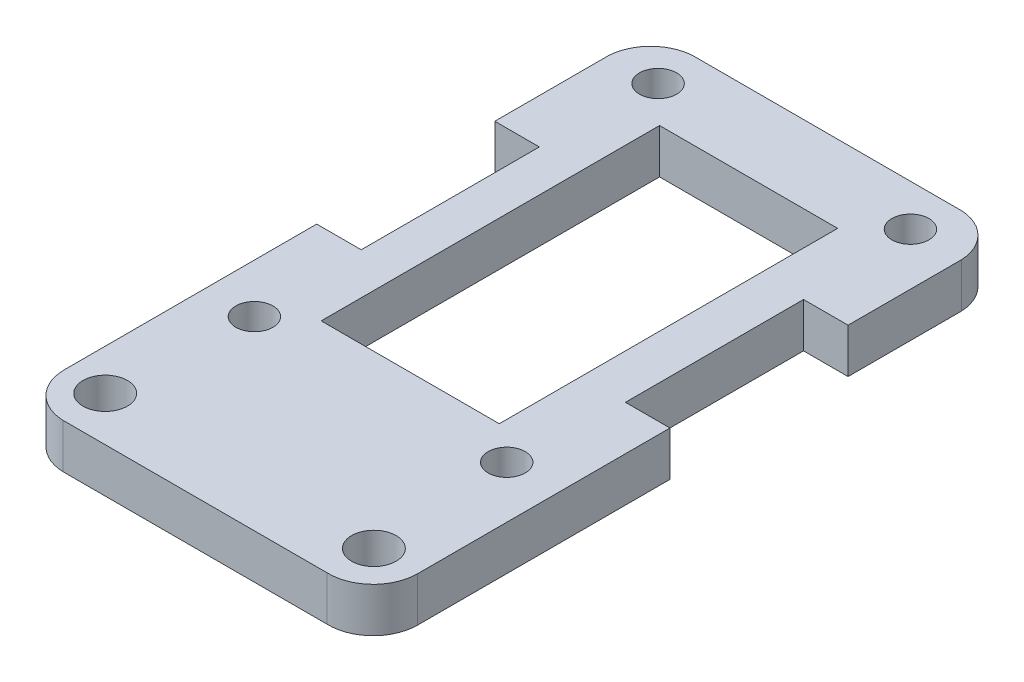
ISO-10303-21;
HEADER;
FILE_DESCRIPTION(('STEP AP214'),'2;1');
FILE_NAME('part.step','',(''),(''),'','','');
FILE_SCHEMA(('AUTOMOTIVE_DESIGN { 1 0 10303 214 1 1 1 1 }'));
ENDSEC;
DATA;
#1=APPLICATION_CONTEXT('core data for automotive mechanical design processes');
#2=APPLICATION_PROTOCOL_DEFINITION('international standard','automotive_design',2000,#1);
#3=PRODUCT_CONTEXT('',#1,'mechanical');
#4=PRODUCT('Part','Part','',(#3));
#5=PRODUCT_RELATED_PRODUCT_CATEGORY('part','',(#4));
#6=PRODUCT_DEFINITION_FORMATION('','',#4);
#7=PRODUCT_DEFINITION_CONTEXT('part definition',#1,'design');
#8=PRODUCT_DEFINITION('design','',#6,#7);
#9=PRODUCT_DEFINITION_SHAPE('','',#8);
#10=(LENGTH_UNIT() NAMED_UNIT(*) SI_UNIT(.MILLI.,.METRE.));
#11=(NAMED_UNIT(*) PLANE_ANGLE_UNIT() SI_UNIT($,.RADIAN.));
#12=(NAMED_UNIT(*) SI_UNIT($,.STERADIAN.) SOLID_ANGLE_UNIT());
#13=UNCERTAINTY_MEASURE_WITH_UNIT(LENGTH_MEASURE(1.E-05),#10,'distance_accuracy_value','');
#14=(GEOMETRIC_REPRESENTATION_CONTEXT(3) GLOBAL_UNCERTAINTY_ASSIGNED_CONTEXT((#13)) GLOBAL_UNIT_ASSIGNED_CONTEXT((#10,
#11,#12)) REPRESENTATION_CONTEXT('',''));
#15=CARTESIAN_POINT('',(0.,0.,0.));
#16=DIRECTION('',(0.,0.,1.));
#17=DIRECTION('',(1.,0.,0.));
#18=AXIS2_PLACEMENT_3D('',#15,#16,#17);
#19=CARTESIAN_POINT('',(-2.44967043371681E-10,3.,-87.9859491726357));
#20=DIRECTION('',(-2.78416094473261E-12,0.,-1.));
#21=DIRECTION('',(-1.,0.,2.78416094473261E-12));
#22=AXIS2_PLACEMENT_3D('',#19,#20,#21);
#23=PLANE('',#22);
#24=DIRECTION('',(1.,0.,-2.78416094473261E-12));
#25=VECTOR('',#24,1.);
#26=CARTESIAN_POINT('',(-2.44967043371681E-10,0.,-87.9859491726357));
#27=LINE('',#26,#25);
#28=CARTESIAN_POINT('',(203.897756421798,0.,-87.9859491732078));
#29=VERTEX_POINT('',#28);
#30=CARTESIAN_POINT('',(221.698885039651,0.,-87.9859491732529));
#31=VERTEX_POINT('',#30);
#32=EDGE_CURVE('E239',#29,#31,#27,.T.);
#33=ORIENTED_EDGE('',*,*,#32,.T.);
#34=DIRECTION('',(0.,-1.,0.));
#35=VECTOR('',#34,1.);
#36=CARTESIAN_POINT('',(221.698885039651,3.,-87.9859491732529));
#37=LINE('',#36,#35);
#38=CARTESIAN_POINT('',(221.698885039651,3.,-87.9859491732529));
#39=VERTEX_POINT('',#38);
#40=EDGE_CURVE('E11',#39,#31,#37,.T.);
#41=ORIENTED_EDGE('',*,*,#40,.F.);
#42=DIRECTION('',(1.,0.,-2.78416094473261E-12));
#43=VECTOR('',#42,1.);
#44=CARTESIAN_POINT('',(-2.44967043371681E-10,3.,-87.9859491726357));
#45=LINE('',#44,#43);
#46=CARTESIAN_POINT('',(203.897756421798,3.,-87.9859491732078));
#47=VERTEX_POINT('',#46);
#48=EDGE_CURVE('E354',#47,#39,#45,.T.);
#49=ORIENTED_EDGE('',*,*,#48,.F.);
#50=DIRECTION('',(0.,-1.,0.));
#51=VECTOR('',#50,1.);
#52=CARTESIAN_POINT('',(203.897756421798,3.,-87.9859491732078));
#53=LINE('',#52,#51);
#54=EDGE_CURVE('E272',#47,#29,#53,.T.);
#55=ORIENTED_EDGE('',*,*,#54,.T.);
#56=EDGE_LOOP('',(#33,#41,#49,#55));
#57=FACE_BOUND('',#56,.T.);
#58=ADVANCED_FACE('F37',(#57),#23,.F.);
#59=CARTESIAN_POINT('',(221.798921253926,3.,-90.9847615240783));
#60=DIRECTION('',(0.,-1.,0.));
#61=DIRECTION('',(0.,0.,-1.));
#62=AXIS2_PLACEMENT_3D('',#59,#60,#61);
#63=CYLINDRICAL_SURFACE('',#62,3.00048042147074);
#64=CARTESIAN_POINT('',(221.798921253926,0.,-90.9847615240783));
#65=DIRECTION('',(0.,1.,0.));
#66=DIRECTION('',(0.,0.,1.));
#67=AXIS2_PLACEMENT_3D('',#64,#65,#66);
#68=CIRCLE('',#67,3.00048042147074);
#69=CARTESIAN_POINT('',(224.79940166353,0.,-90.9850283744484));
#70=VERTEX_POINT('',#69);
#71=EDGE_CURVE('E242',#31,#70,#68,.T.);
#72=ORIENTED_EDGE('',*,*,#71,.T.);
#73=DIRECTION('',(0.,-1.,0.));
#74=VECTOR('',#73,1.);
#75=CARTESIAN_POINT('',(224.79940166353,3.,-90.9850283744484));
#76=LINE('',#75,#74);
#77=CARTESIAN_POINT('',(224.79940166353,3.,-90.9850283744484));
#78=VERTEX_POINT('',#77);
#79=EDGE_CURVE('E47',#78,#70,#76,.T.);
#80=ORIENTED_EDGE('',*,*,#79,.F.);
#81=CARTESIAN_POINT('',(221.798921253926,3.,-90.9847615240783));
#82=DIRECTION('',(0.,1.,0.));
#83=DIRECTION('',(0.,0.,1.));
#84=AXIS2_PLACEMENT_3D('',#81,#82,#83);
#85=CIRCLE('',#84,3.00048042147074);
#86=EDGE_CURVE('E356',#39,#78,#85,.T.);
#87=ORIENTED_EDGE('',*,*,#86,.F.);
#88=ORIENTED_EDGE('',*,*,#40,.T.);
#89=EDGE_LOOP('',(#72,#80,#87,#88));
#90=FACE_BOUND('',#89,.T.);
#91=ADVANCED_FACE('F407',(#90),#63,.T.);
#92=CARTESIAN_POINT('',(224.79940166353,3.,0.));
#93=DIRECTION('',(-1.,0.,0.));
#94=DIRECTION('',(0.,0.,1.));
#95=AXIS2_PLACEMENT_3D('',#92,#93,#94);
#96=PLANE('',#95);
#97=DIRECTION('',(0.,0.,-1.));
#98=VECTOR('',#97,1.);
#99=CARTESIAN_POINT('',(224.79940166353,0.,0.));
#100=LINE('',#99,#98);
#101=CARTESIAN_POINT('',(224.79940166353,0.,-107.985882496448));
#102=VERTEX_POINT('',#101);
#103=EDGE_CURVE('E244',#70,#102,#100,.T.);
#104=ORIENTED_EDGE('',*,*,#103,.T.);
#105=DIRECTION('',(0.,-1.,0.));
#106=VECTOR('',#105,1.);
#107=CARTESIAN_POINT('',(224.79940166353,3.,-107.985882496448));
#108=LINE('',#107,#106);
#109=CARTESIAN_POINT('',(224.79940166353,3.,-107.985882496448));
#110=VERTEX_POINT('',#109);
#111=EDGE_CURVE('E301',#110,#102,#108,.T.);
#112=ORIENTED_EDGE('',*,*,#111,.F.);
#113=DIRECTION('',(0.,0.,-1.));
#114=VECTOR('',#113,1.);
#115=CARTESIAN_POINT('',(224.79940166353,3.,0.));
#116=LINE('',#115,#114);
#117=EDGE_CURVE('E358',#78,#110,#116,.T.);
#118=ORIENTED_EDGE('',*,*,#117,.F.);
#119=ORIENTED_EDGE('',*,*,#79,.T.);
#120=EDGE_LOOP('',(#104,#112,#118,#119));
#121=FACE_BOUND('',#120,.T.);
#122=ADVANCED_FACE('F412',(#121),#96,.F.);
#123=CARTESIAN_POINT('',(0.,3.,-107.985882496448));
#124=DIRECTION('',(0.,0.,1.));
#125=DIRECTION('',(1.,0.,0.));
#126=AXIS2_PLACEMENT_3D('',#123,#124,#125);
#127=PLANE('',#126);
#128=DIRECTION('',(-1.,0.,0.));
#129=VECTOR('',#128,1.);
#130=CARTESIAN_POINT('',(0.,0.,-107.985882496448));
#131=LINE('',#130,#129);
#132=CARTESIAN_POINT('',(221.79940166353,0.,-107.985882496448));
#133=VERTEX_POINT('',#132);
#134=EDGE_CURVE('E246',#102,#133,#131,.T.);
#135=ORIENTED_EDGE('',*,*,#134,.T.);
#136=DIRECTION('',(0.,-1.,0.));
#137=VECTOR('',#136,1.);
#138=CARTESIAN_POINT('',(221.79940166353,3.,-107.985882496448));
#139=LINE('',#138,#137);
#140=CARTESIAN_POINT('',(221.79940166353,3.,-107.985882496448));
#141=VERTEX_POINT('',#140);
#142=EDGE_CURVE('E298',#141,#133,#139,.T.);
#143=ORIENTED_EDGE('',*,*,#142,.F.);
#144=DIRECTION('',(-1.,0.,0.));
#145=VECTOR('',#144,1.);
#146=CARTESIAN_POINT('',(0.,3.,-107.985882496448));
#147=LINE('',#146,#145);
#148=EDGE_CURVE('E360',#110,#141,#147,.T.);
#149=ORIENTED_EDGE('',*,*,#148,.F.);
#150=ORIENTED_EDGE('',*,*,#111,.T.);
#151=EDGE_LOOP('',(#135,#143,#149,#150));
#152=FACE_BOUND('',#151,.T.);
#153=ADVANCED_FACE('F484',(#152),#127,.F.);
#154=CARTESIAN_POINT('',(221.79940166353,3.,0.));
#155=DIRECTION('',(-1.,0.,0.));
#156=DIRECTION('',(0.,0.,1.));
#157=AXIS2_PLACEMENT_3D('',#154,#155,#156);
#158=PLANE('',#157);
#159=DIRECTION('',(0.,0.,-1.));
#160=VECTOR('',#159,1.);
#161=CARTESIAN_POINT('',(221.79940166353,0.,0.));
#162=LINE('',#161,#160);
#163=CARTESIAN_POINT('',(221.79940166353,0.,-119.985882496448));
#164=VERTEX_POINT('',#163);
#165=EDGE_CURVE('E248',#133,#164,#162,.T.);
#166=ORIENTED_EDGE('',*,*,#165,.T.);
#167=DIRECTION('',(0.,-1.,0.));
#168=VECTOR('',#167,1.);
#169=CARTESIAN_POINT('',(221.79940166353,3.,-119.985882496448));
#170=LINE('',#169,#168);
#171=CARTESIAN_POINT('',(221.79940166353,3.,-119.985882496448));
#172=VERTEX_POINT('',#171);
#173=EDGE_CURVE('E295',#172,#164,#170,.T.);
#174=ORIENTED_EDGE('',*,*,#173,.F.);
#175=DIRECTION('',(0.,0.,-1.));
#176=VECTOR('',#175,1.);
#177=CARTESIAN_POINT('',(221.79940166353,3.,0.));
#178=LINE('',#177,#176);
#179=EDGE_CURVE('E362',#141,#172,#178,.T.);
#180=ORIENTED_EDGE('',*,*,#179,.F.);
#181=ORIENTED_EDGE('',*,*,#142,.T.);
#182=EDGE_LOOP('',(#166,#174,#180,#181));
#183=FACE_BOUND('',#182,.T.);
#184=ADVANCED_FACE('F480',(#183),#158,.F.);
#185=CARTESIAN_POINT('',(0.,3.,-119.985882496448));
#186=DIRECTION('',(0.,0.,-1.));
#187=DIRECTION('',(-1.,0.,0.));
#188=AXIS2_PLACEMENT_3D('',#185,#186,#187);
#189=PLANE('',#188);
#190=DIRECTION('',(1.,0.,0.));
#191=VECTOR('',#190,1.);
#192=CARTESIAN_POINT('',(0.,0.,-119.985882496448));
#193=LINE('',#192,#191);
#194=CARTESIAN_POINT('',(224.79940166353,0.,-119.985882496448));
#195=VERTEX_POINT('',#194);
#196=EDGE_CURVE('E250',#164,#195,#193,.T.);
#197=ORIENTED_EDGE('',*,*,#196,.T.);
#198=DIRECTION('',(0.,-1.,0.));
#199=VECTOR('',#198,1.);
#200=CARTESIAN_POINT('',(224.79940166353,3.,-119.985882496448));
#201=LINE('',#200,#199);
#202=CARTESIAN_POINT('',(224.79940166353,3.,-119.985882496448));
#203=VERTEX_POINT('',#202);
#204=EDGE_CURVE('E292',#203,#195,#201,.T.);
#205=ORIENTED_EDGE('',*,*,#204,.F.);
#206=DIRECTION('',(1.,0.,0.));
#207=VECTOR('',#206,1.);
#208=CARTESIAN_POINT('',(0.,3.,-119.985882496448));
#209=LINE('',#208,#207);
#210=EDGE_CURVE('E364',#172,#203,#209,.T.);
#211=ORIENTED_EDGE('',*,*,#210,.F.);
#212=ORIENTED_EDGE('',*,*,#173,.T.);
#213=EDGE_LOOP('',(#197,#205,#211,#212));
#214=FACE_BOUND('',#213,.T.);
#215=ADVANCED_FACE('F476',(#214),#189,.F.);
#216=CARTESIAN_POINT('',(224.79940166353,3.,0.));
#217=DIRECTION('',(-1.,0.,0.));
#218=DIRECTION('',(0.,0.,1.));
#219=AXIS2_PLACEMENT_3D('',#216,#217,#218);
#220=PLANE('',#219);
#221=DIRECTION('',(0.,0.,-1.));
#222=VECTOR('',#221,1.);
#223=CARTESIAN_POINT('',(224.79940166353,0.,0.));
#224=LINE('',#223,#222);
#225=CARTESIAN_POINT('',(224.799401663601,0.,-127.645063488541));
#226=VERTEX_POINT('',#225);
#227=EDGE_CURVE('E252',#195,#226,#224,.T.);
#228=ORIENTED_EDGE('',*,*,#227,.T.);
#229=DIRECTION('',(0.,-1.,0.));
#230=VECTOR('',#229,1.);
#231=CARTESIAN_POINT('',(224.799401663601,3.,-127.645063488541));
#232=LINE('',#231,#230);
#233=CARTESIAN_POINT('',(224.799401663601,3.,-127.645063488541));
#234=VERTEX_POINT('',#233);
#235=EDGE_CURVE('E289',#234,#226,#232,.T.);
#236=ORIENTED_EDGE('',*,*,#235,.F.);
#237=DIRECTION('',(0.,0.,-1.));
#238=VECTOR('',#237,1.);
#239=CARTESIAN_POINT('',(224.79940166353,3.,0.));
#240=LINE('',#239,#238);
#241=EDGE_CURVE('E366',#203,#234,#240,.T.);
#242=ORIENTED_EDGE('',*,*,#241,.F.);
#243=ORIENTED_EDGE('',*,*,#204,.T.);
#244=EDGE_LOOP('',(#228,#236,#242,#243));
#245=FACE_BOUND('',#244,.T.);
#246=ADVANCED_FACE('F472',(#245),#220,.F.);
#247=CARTESIAN_POINT('',(221.80306652203,3.,-127.494223255448));
#248=DIRECTION('',(0.,-1.,0.));
#249=DIRECTION('',(0.,0.,-1.));
#250=AXIS2_PLACEMENT_3D('',#247,#248,#249);
#251=CYLINDRICAL_SURFACE('',#250,3.00012950662673);
#252=CARTESIAN_POINT('',(221.80306652203,0.,-127.494223255448));
#253=DIRECTION('',(0.,1.,0.));
#254=DIRECTION('',(0.,0.,1.));
#255=AXIS2_PLACEMENT_3D('',#252,#253,#254);
#256=CIRCLE('',#255,3.00012950662673);
#257=CARTESIAN_POINT('',(221.603142855192,0.,-130.487684059262));
#258=VERTEX_POINT('',#257);
#259=EDGE_CURVE('E254',#226,#258,#256,.T.);
#260=ORIENTED_EDGE('',*,*,#259,.T.);
#261=DIRECTION('',(0.,-1.,0.));
#262=VECTOR('',#261,1.);
#263=CARTESIAN_POINT('',(221.603142855192,3.,-130.487684059262));
#264=LINE('',#263,#262);
#265=CARTESIAN_POINT('',(221.603142855192,3.,-130.487684059262));
#266=VERTEX_POINT('',#265);
#267=EDGE_CURVE('E287',#266,#258,#264,.T.);
#268=ORIENTED_EDGE('',*,*,#267,.F.);
#269=CARTESIAN_POINT('',(221.80306652203,3.,-127.494223255448));
#270=DIRECTION('',(0.,1.,0.));
#271=DIRECTION('',(0.,0.,1.));
#272=AXIS2_PLACEMENT_3D('',#269,#270,#271);
#273=CIRCLE('',#272,3.00012950662673);
#274=EDGE_CURVE('E368',#234,#266,#273,.T.);
#275=ORIENTED_EDGE('',*,*,#274,.F.);
#276=ORIENTED_EDGE('',*,*,#235,.T.);
#277=EDGE_LOOP('',(#260,#268,#275,#276));
#278=FACE_BOUND('',#277,.T.);
#279=ADVANCED_FACE('F468',(#278),#251,.T.);
#280=CARTESIAN_POINT('',(9.1728446404953E-11,3.,-130.487684059418));
#281=DIRECTION('',(7.02966314914319E-13,0.,-1.));
#282=DIRECTION('',(-1.,0.,-7.02966314914319E-13));
#283=AXIS2_PLACEMENT_3D('',#280,#281,#282);
#284=PLANE('',#283);
#285=DIRECTION('',(1.,0.,7.02966314914319E-13));
#286=VECTOR('',#285,1.);
#287=CARTESIAN_POINT('',(9.1728446404953E-11,0.,-130.487684059418));
#288=LINE('',#287,#286);
#289=CARTESIAN_POINT('',(203.993498606336,0.,-130.487684059275));
#290=VERTEX_POINT('',#289);
#291=EDGE_CURVE('E257',#290,#258,#288,.T.);
#292=ORIENTED_EDGE('',*,*,#291,.F.);
#293=DIRECTION('',(0.,-1.,0.));
#294=VECTOR('',#293,1.);
#295=CARTESIAN_POINT('',(203.993498606336,3.,-130.487684059275));
#296=LINE('',#295,#294);
#297=CARTESIAN_POINT('',(203.993498606336,3.,-130.487684059275));
#298=VERTEX_POINT('',#297);
#299=EDGE_CURVE('E285',#298,#290,#296,.T.);
#300=ORIENTED_EDGE('',*,*,#299,.F.);
#301=DIRECTION('',(1.,0.,7.02966314914319E-13));
#302=VECTOR('',#301,1.);
#303=CARTESIAN_POINT('',(9.1728446404953E-11,3.,-130.487684059418));
#304=LINE('',#303,#302);
#305=EDGE_CURVE('E370',#298,#266,#304,.T.);
#306=ORIENTED_EDGE('',*,*,#305,.T.);
#307=ORIENTED_EDGE('',*,*,#267,.T.);
#308=EDGE_LOOP('',(#292,#300,#306,#307));
#309=FACE_BOUND('',#308,.T.);
#310=ADVANCED_FACE('F464',(#309),#284,.T.);
#311=CARTESIAN_POINT('',(203.993498606365,3.,-127.48755455261));
#312=DIRECTION('',(0.,-1.,0.));
#313=DIRECTION('',(0.,0.,-1.));
#314=AXIS2_PLACEMENT_3D('',#311,#312,#313);
#315=CYLINDRICAL_SURFACE('',#314,3.00012950666449);
#316=CARTESIAN_POINT('',(203.993498606365,0.,-127.48755455261));
#317=DIRECTION('',(0.,1.,0.));
#318=DIRECTION('',(0.,0.,1.));
#319=AXIS2_PLACEMENT_3D('',#316,#317,#318);
#320=CIRCLE('',#319,3.00012950666449);
#321=CARTESIAN_POINT('',(200.99748000373,0.,-127.644556429748));
#322=VERTEX_POINT('',#321);
#323=EDGE_CURVE('E260',#290,#322,#320,.T.);
#324=ORIENTED_EDGE('',*,*,#323,.T.);
#325=DIRECTION('',(0.,-1.,0.));
#326=VECTOR('',#325,1.);
#327=CARTESIAN_POINT('',(200.99748000373,3.,-127.644556429748));
#328=LINE('',#327,#326);
#329=CARTESIAN_POINT('',(200.99748000373,3.,-127.644556429748));
#330=VERTEX_POINT('',#329);
#331=EDGE_CURVE('E282',#330,#322,#328,.T.);
#332=ORIENTED_EDGE('',*,*,#331,.F.);
#333=CARTESIAN_POINT('',(203.993498606365,3.,-127.48755455261));
#334=DIRECTION('',(0.,1.,0.));
#335=DIRECTION('',(0.,0.,1.));
#336=AXIS2_PLACEMENT_3D('',#333,#334,#335);
#337=CIRCLE('',#336,3.00012950666449);
#338=EDGE_CURVE('E373',#298,#330,#337,.T.);
#339=ORIENTED_EDGE('',*,*,#338,.F.);
#340=ORIENTED_EDGE('',*,*,#299,.T.);
#341=EDGE_LOOP('',(#324,#332,#339,#340));
#342=FACE_BOUND('',#341,.T.);
#343=ADVANCED_FACE('F460',(#342),#315,.T.);
#344=CARTESIAN_POINT('',(200.99748000373,3.,0.));
#345=DIRECTION('',(1.,0.,0.));
#346=DIRECTION('',(0.,0.,-1.));
#347=AXIS2_PLACEMENT_3D('',#344,#345,#346);
#348=PLANE('',#347);
#349=DIRECTION('',(0.,0.,1.));
#350=VECTOR('',#349,1.);
#351=CARTESIAN_POINT('',(200.99748000373,0.,0.));
#352=LINE('',#351,#350);
#353=CARTESIAN_POINT('',(200.99748000373,0.,-119.985882496448));
#354=VERTEX_POINT('',#353);
#355=EDGE_CURVE('E262',#322,#354,#352,.T.);
#356=ORIENTED_EDGE('',*,*,#355,.T.);
#357=DIRECTION('',(0.,-1.,0.));
#358=VECTOR('',#357,1.);
#359=CARTESIAN_POINT('',(200.99748000373,3.,-119.985882496448));
#360=LINE('',#359,#358);
#361=CARTESIAN_POINT('',(200.99748000373,3.,-119.985882496448));
#362=VERTEX_POINT('',#361);
#363=EDGE_CURVE('E279',#362,#354,#360,.T.);
#364=ORIENTED_EDGE('',*,*,#363,.F.);
#365=DIRECTION('',(0.,0.,1.));
#366=VECTOR('',#365,1.);
#367=CARTESIAN_POINT('',(200.99748000373,3.,0.));
#368=LINE('',#367,#366);
#369=EDGE_CURVE('E375',#330,#362,#368,.T.);
#370=ORIENTED_EDGE('',*,*,#369,.F.);
#371=ORIENTED_EDGE('',*,*,#331,.T.);
#372=EDGE_LOOP('',(#356,#364,#370,#371));
#373=FACE_BOUND('',#372,.T.);
#374=ADVANCED_FACE('F457',(#373),#348,.F.);
#375=CARTESIAN_POINT('',(0.,3.,-119.985882496448));
#376=DIRECTION('',(0.,0.,-1.));
#377=DIRECTION('',(-1.,0.,0.));
#378=AXIS2_PLACEMENT_3D('',#375,#376,#377);
#379=PLANE('',#378);
#380=DIRECTION('',(1.,0.,0.));
#381=VECTOR('',#380,1.);
#382=CARTESIAN_POINT('',(0.,0.,-119.985882496448));
#383=LINE('',#382,#381);
#384=CARTESIAN_POINT('',(203.99772021203,0.,-119.985882496448));
#385=VERTEX_POINT('',#384);
#386=EDGE_CURVE('E264',#354,#385,#383,.T.);
#387=ORIENTED_EDGE('',*,*,#386,.T.);
#388=DIRECTION('',(0.,-1.,0.));
#389=VECTOR('',#388,1.);
#390=CARTESIAN_POINT('',(203.99772021203,3.,-119.985882496448));
#391=LINE('',#390,#389);
#392=CARTESIAN_POINT('',(203.99772021203,3.,-119.985882496448));
#393=VERTEX_POINT('',#392);
#394=EDGE_CURVE('E276',#393,#385,#391,.T.);
#395=ORIENTED_EDGE('',*,*,#394,.F.);
#396=DIRECTION('',(1.,0.,0.));
#397=VECTOR('',#396,1.);
#398=CARTESIAN_POINT('',(0.,3.,-119.985882496448));
#399=LINE('',#398,#397);
#400=EDGE_CURVE('E377',#362,#393,#399,.T.);
#401=ORIENTED_EDGE('',*,*,#400,.F.);
#402=ORIENTED_EDGE('',*,*,#363,.T.);
#403=EDGE_LOOP('',(#387,#395,#401,#402));
#404=FACE_BOUND('',#403,.T.);
#405=ADVANCED_FACE('F383',(#404),#379,.F.);
#406=CARTESIAN_POINT('',(203.99772021203,3.,0.));
#407=DIRECTION('',(1.,0.,0.));
#408=DIRECTION('',(0.,0.,-1.));
#409=AXIS2_PLACEMENT_3D('',#406,#407,#408);
#410=PLANE('',#409);
#411=DIRECTION('',(0.,0.,1.));
#412=VECTOR('',#411,1.);
#413=CARTESIAN_POINT('',(203.99772021203,0.,0.));
#414=LINE('',#413,#412);
#415=CARTESIAN_POINT('',(203.99772021203,0.,-107.985882496448));
#416=VERTEX_POINT('',#415);
#417=EDGE_CURVE('E266',#385,#416,#414,.T.);
#418=ORIENTED_EDGE('',*,*,#417,.T.);
#419=DIRECTION('',(0.,-1.,0.));
#420=VECTOR('',#419,1.);
#421=CARTESIAN_POINT('',(203.99772021203,3.,-107.985882496448));
#422=LINE('',#421,#420);
#423=CARTESIAN_POINT('',(203.99772021203,3.,-107.985882496448));
#424=VERTEX_POINT('',#423);
#425=EDGE_CURVE('E200',#424,#416,#422,.T.);
#426=ORIENTED_EDGE('',*,*,#425,.F.);
#427=DIRECTION('',(0.,0.,1.));
#428=VECTOR('',#427,1.);
#429=CARTESIAN_POINT('',(203.99772021203,3.,0.));
#430=LINE('',#429,#428);
#431=EDGE_CURVE('E191',#393,#424,#430,.T.);
#432=ORIENTED_EDGE('',*,*,#431,.F.);
#433=ORIENTED_EDGE('',*,*,#394,.T.);
#434=EDGE_LOOP('',(#418,#426,#432,#433));
#435=FACE_BOUND('',#434,.T.);
#436=ADVANCED_FACE('F387',(#435),#410,.F.);
#437=CARTESIAN_POINT('',(0.,3.,-107.985882496448));
#438=DIRECTION('',(0.,0.,1.));
#439=DIRECTION('',(1.,0.,0.));
#440=AXIS2_PLACEMENT_3D('',#437,#438,#439);
#441=PLANE('',#440);
#442=DIRECTION('',(-1.,0.,0.));
#443=VECTOR('',#442,1.);
#444=CARTESIAN_POINT('',(0.,0.,-107.985882496448));
#445=LINE('',#444,#443);
#446=CARTESIAN_POINT('',(200.99748000373,0.,-107.985882496448));
#447=VERTEX_POINT('',#446);
#448=EDGE_CURVE('E199',#416,#447,#445,.T.);
#449=ORIENTED_EDGE('',*,*,#448,.T.);
#450=DIRECTION('',(0.,-1.,0.));
#451=VECTOR('',#450,1.);
#452=CARTESIAN_POINT('',(200.99748000373,3.,-107.985882496448));
#453=LINE('',#452,#451);
#454=CARTESIAN_POINT('',(200.99748000373,3.,-107.985882496448));
#455=VERTEX_POINT('',#454);
#456=EDGE_CURVE('E196',#455,#447,#453,.T.);
#457=ORIENTED_EDGE('',*,*,#456,.F.);
#458=DIRECTION('',(-1.,0.,0.));
#459=VECTOR('',#458,1.);
#460=CARTESIAN_POINT('',(0.,3.,-107.985882496448));
#461=LINE('',#460,#459);
#462=EDGE_CURVE('E185',#424,#455,#461,.T.);
#463=ORIENTED_EDGE('',*,*,#462,.F.);
#464=ORIENTED_EDGE('',*,*,#425,.T.);
#465=EDGE_LOOP('',(#449,#457,#463,#464));
#466=FACE_BOUND('',#465,.T.);
#467=ADVANCED_FACE('F197',(#466),#441,.F.);
#468=CARTESIAN_POINT('',(200.997480003358,3.,6.93939659570069E-10));
#469=DIRECTION('',(1.,0.,3.45247940202274E-12));
#470=DIRECTION('',(3.45247940202274E-12,0.,-1.));
#471=AXIS2_PLACEMENT_3D('',#468,#469,#470);
#472=PLANE('',#471);
#473=DIRECTION('',(-3.45247940202274E-12,0.,1.));
#474=VECTOR('',#473,1.);
#475=CARTESIAN_POINT('',(200.997480003358,0.,6.93939659570069E-10));
#476=LINE('',#475,#474);
#477=CARTESIAN_POINT('',(200.997480003652,0.,-90.9845213157454));
#478=VERTEX_POINT('',#477);
#479=EDGE_CURVE('E121',#447,#478,#476,.T.);
#480=ORIENTED_EDGE('',*,*,#479,.T.);
#481=DIRECTION('',(0.,-1.,0.));
#482=VECTOR('',#481,1.);
#483=CARTESIAN_POINT('',(200.997480003652,3.,-90.9845213157454));
#484=LINE('',#483,#482);
#485=CARTESIAN_POINT('',(200.997480003652,3.,-90.9845213157454));
#486=VERTEX_POINT('',#485);
#487=EDGE_CURVE('E201',#486,#478,#484,.T.);
#488=ORIENTED_EDGE('',*,*,#487,.F.);
#489=DIRECTION('',(-3.45247940202274E-12,0.,1.));
#490=VECTOR('',#489,1.);
#491=CARTESIAN_POINT('',(200.997480003358,3.,6.93939659570069E-10));
#492=LINE('',#491,#490);
#493=EDGE_CURVE('E189',#455,#486,#492,.T.);
#494=ORIENTED_EDGE('',*,*,#493,.F.);
#495=ORIENTED_EDGE('',*,*,#456,.T.);
#496=EDGE_LOOP('',(#480,#488,#494,#495));
#497=FACE_BOUND('',#496,.T.);
#498=ADVANCED_FACE('F203',(#497),#472,.F.);
#499=CARTESIAN_POINT('',(218.79880114743,3.,0.));
#500=DIRECTION('',(-1.,0.,0.));
#501=DIRECTION('',(0.,0.,1.));
#502=AXIS2_PLACEMENT_3D('',#499,#500,#501);
#503=PLANE('',#502);
#504=DIRECTION('',(0.,0.,-1.));
#505=VECTOR('',#504,1.);
#506=CARTESIAN_POINT('',(218.79880114743,0.,0.));
#507=LINE('',#506,#505);
#508=CARTESIAN_POINT('',(218.79880114743,0.,-102.485949173248));
#509=VERTEX_POINT('',#508);
#510=CARTESIAN_POINT('',(218.79880114743,0.,-125.285949173248));
#511=VERTEX_POINT('',#510);
#512=EDGE_CURVE('E209',#509,#511,#507,.T.);
#513=ORIENTED_EDGE('',*,*,#512,.F.);
#514=DIRECTION('',(0.,-1.,0.));
#515=VECTOR('',#514,1.);
#516=CARTESIAN_POINT('',(218.79880114743,3.,-102.485949173248));
#517=LINE('',#516,#515);
#518=CARTESIAN_POINT('',(218.79880114743,3.,-102.485949173248));
#519=VERTEX_POINT('',#518);
#520=EDGE_CURVE('E41',#519,#509,#517,.T.);
#521=ORIENTED_EDGE('',*,*,#520,.F.);
#522=DIRECTION('',(0.,0.,-1.));
#523=VECTOR('',#522,1.);
#524=CARTESIAN_POINT('',(218.79880114743,3.,0.));
#525=LINE('',#524,#523);
#526=CARTESIAN_POINT('',(218.79880114743,3.,-125.285949173248));
#527=VERTEX_POINT('',#526);
#528=EDGE_CURVE('E271',#519,#527,#525,.T.);
#529=ORIENTED_EDGE('',*,*,#528,.T.);
#530=DIRECTION('',(0.,-1.,0.));
#531=VECTOR('',#530,1.);
#532=CARTESIAN_POINT('',(218.79880114743,3.,-125.285949173248));
#533=LINE('',#532,#531);
#534=EDGE_CURVE('E205',#527,#511,#533,.T.);
#535=ORIENTED_EDGE('',*,*,#534,.T.);
#536=EDGE_LOOP('',(#513,#521,#529,#535));
#537=FACE_BOUND('',#536,.T.);
#538=ADVANCED_FACE('F39',(#537),#503,.T.);
#539=CARTESIAN_POINT('',(0.,3.,-102.485949173248));
#540=DIRECTION('',(0.,0.,-1.));
#541=DIRECTION('',(-1.,0.,0.));
#542=AXIS2_PLACEMENT_3D('',#539,#540,#541);
#543=PLANE('',#542);
#544=DIRECTION('',(1.,0.,0.));
#545=VECTOR('',#544,1.);
#546=CARTESIAN_POINT('',(0.,0.,-102.485949173248));
#547=LINE('',#546,#545);
#548=CARTESIAN_POINT('',(206.79784031403,0.,-102.485949173248));
#549=VERTEX_POINT('',#548);
#550=EDGE_CURVE('E212',#549,#509,#547,.T.);
#551=ORIENTED_EDGE('',*,*,#550,.F.);
#552=DIRECTION('',(0.,-1.,0.));
#553=VECTOR('',#552,1.);
#554=CARTESIAN_POINT('',(206.79784031403,3.,-102.485949173248));
#555=LINE('',#554,#553);
#556=CARTESIAN_POINT('',(206.79784031403,3.,-102.485949173248));
#557=VERTEX_POINT('',#556);
#558=EDGE_CURVE('E308',#557,#549,#555,.T.);
#559=ORIENTED_EDGE('',*,*,#558,.F.);
#560=DIRECTION('',(1.,0.,0.));
#561=VECTOR('',#560,1.);
#562=CARTESIAN_POINT('',(0.,3.,-102.485949173248));
#563=LINE('',#562,#561);
#564=EDGE_CURVE('E317',#557,#519,#563,.T.);
#565=ORIENTED_EDGE('',*,*,#564,.T.);
#566=ORIENTED_EDGE('',*,*,#520,.T.);
#567=EDGE_LOOP('',(#551,#559,#565,#566));
#568=FACE_BOUND('',#567,.T.);
#569=ADVANCED_FACE('F315',(#568),#543,.T.);
#570=CARTESIAN_POINT('',(206.79784031403,3.,0.));
#571=DIRECTION('',(1.,0.,0.));
#572=DIRECTION('',(0.,0.,-1.));
#573=AXIS2_PLACEMENT_3D('',#570,#571,#572);
#574=PLANE('',#573);
#575=DIRECTION('',(0.,0.,1.));
#576=VECTOR('',#575,1.);
#577=CARTESIAN_POINT('',(206.79784031403,0.,0.));
#578=LINE('',#577,#576);
#579=CARTESIAN_POINT('',(206.79784031403,0.,-125.285949173248));
#580=VERTEX_POINT('',#579);
#581=EDGE_CURVE('E215',#580,#549,#578,.T.);
#582=ORIENTED_EDGE('',*,*,#581,.F.);
#583=DIRECTION('',(0.,-1.,0.));
#584=VECTOR('',#583,1.);
#585=CARTESIAN_POINT('',(206.79784031403,3.,-125.285949173248));
#586=LINE('',#585,#584);
#587=CARTESIAN_POINT('',(206.79784031403,3.,-125.285949173248));
#588=VERTEX_POINT('',#587);
#589=EDGE_CURVE('E307',#588,#580,#586,.T.);
#590=ORIENTED_EDGE('',*,*,#589,.F.);
#591=DIRECTION('',(0.,0.,1.));
#592=VECTOR('',#591,1.);
#593=CARTESIAN_POINT('',(206.79784031403,3.,0.));
#594=LINE('',#593,#592);
#595=EDGE_CURVE('E324',#588,#557,#594,.T.);
#596=ORIENTED_EDGE('',*,*,#595,.T.);
#597=ORIENTED_EDGE('',*,*,#558,.T.);
#598=EDGE_LOOP('',(#582,#590,#596,#597));
#599=FACE_BOUND('',#598,.T.);
#600=ADVANCED_FACE('F322',(#599),#574,.T.);
#601=CARTESIAN_POINT('',(221.299311624831,3.,-127.688016927548));
#602=DIRECTION('',(0.,-1.,0.));
#603=DIRECTION('',(0.,0.,-1.));
#604=AXIS2_PLACEMENT_3D('',#601,#602,#603);
#605=CYLINDRICAL_SURFACE('',#604,1.25000000000001);
#606=CARTESIAN_POINT('',(221.299311624831,3.,-127.688016927548));
#607=DIRECTION('',(0.,1.,0.));
#608=DIRECTION('',(0.,0.,1.));
#609=AXIS2_PLACEMENT_3D('',#606,#607,#608);
#610=CIRCLE('',#609,1.25000000000001);
#611=CARTESIAN_POINT('',(221.299311624831,3.,-126.438016927548));
#612=VERTEX_POINT('',#611);
#613=EDGE_CURVE('E351',#612,#612,#610,.T.);
#614=ORIENTED_EDGE('',*,*,#613,.T.);
#615=EDGE_LOOP('',(#614));
#616=FACE_BOUND('',#615,.T.);
#617=CARTESIAN_POINT('',(221.299311624831,0.,-127.688016927548));
#618=DIRECTION('',(0.,1.,0.));
#619=DIRECTION('',(0.,0.,1.));
#620=AXIS2_PLACEMENT_3D('',#617,#618,#619);
#621=CIRCLE('',#620,1.25000000000001);
#622=CARTESIAN_POINT('',(221.299311624831,0.,-126.438016927548));
#623=VERTEX_POINT('',#622);
#624=EDGE_CURVE('E236',#623,#623,#621,.T.);
#625=ORIENTED_EDGE('',*,*,#624,.F.);
#626=EDGE_LOOP('',(#625));
#627=FACE_BOUND('',#626,.T.);
#628=ADVANCED_FACE('F417',(#616,#627),#605,.F.);
#629=CARTESIAN_POINT('',(204.297950444131,3.,-127.688016927548));
#630=DIRECTION('',(0.,-1.,0.));
#631=DIRECTION('',(0.,0.,-1.));
#632=AXIS2_PLACEMENT_3D('',#629,#630,#631);
#633=CYLINDRICAL_SURFACE('',#632,1.25000000000001);
#634=CARTESIAN_POINT('',(204.297950444131,3.,-127.688016927548));
#635=DIRECTION('',(0.,1.,0.));
#636=DIRECTION('',(0.,0.,1.));
#637=AXIS2_PLACEMENT_3D('',#634,#635,#636);
#638=CIRCLE('',#637,1.25000000000001);
#639=CARTESIAN_POINT('',(204.297950444131,3.,-126.438016927548));
#640=VERTEX_POINT('',#639);
#641=EDGE_CURVE('E348',#640,#640,#638,.T.);
#642=ORIENTED_EDGE('',*,*,#641,.T.);
#643=EDGE_LOOP('',(#642));
#644=FACE_BOUND('',#643,.T.);
#645=CARTESIAN_POINT('',(204.297950444131,0.,-127.688016927548));
#646=DIRECTION('',(0.,1.,0.));
#647=DIRECTION('',(0.,0.,1.));
#648=AXIS2_PLACEMENT_3D('',#645,#646,#647);
#649=CIRCLE('',#648,1.25000000000001);
#650=CARTESIAN_POINT('',(204.297950444131,0.,-126.438016927548));
#651=VERTEX_POINT('',#650);
#652=EDGE_CURVE('E233',#651,#651,#649,.T.);
#653=ORIENTED_EDGE('',*,*,#652,.F.);
#654=EDGE_LOOP('',(#653));
#655=FACE_BOUND('',#654,.T.);
#656=ADVANCED_FACE('F420',(#644,#655),#633,.F.);
#657=CARTESIAN_POINT('',(221.299311624831,3.,-100.485839038348));
#658=DIRECTION('',(0.,-1.,0.));
#659=DIRECTION('',(0.,0.,-1.));
#660=AXIS2_PLACEMENT_3D('',#657,#658,#659);
#661=CYLINDRICAL_SURFACE('',#660,1.25000000000001);
#662=CARTESIAN_POINT('',(221.299311624831,3.,-100.485839038348));
#663=DIRECTION('',(0.,1.,0.));
#664=DIRECTION('',(0.,0.,1.));
#665=AXIS2_PLACEMENT_3D('',#662,#663,#664);
#666=CIRCLE('',#665,1.25000000000001);
#667=CARTESIAN_POINT('',(221.299311624831,3.,-99.2358390383483));
#668=VERTEX_POINT('',#667);
#669=EDGE_CURVE('E345',#668,#668,#666,.T.);
#670=ORIENTED_EDGE('',*,*,#669,.T.);
#671=EDGE_LOOP('',(#670));
#672=FACE_BOUND('',#671,.T.);
#673=CARTESIAN_POINT('',(221.299311624831,0.,-100.485839038348));
#674=DIRECTION('',(0.,1.,0.));
#675=DIRECTION('',(0.,0.,1.));
#676=AXIS2_PLACEMENT_3D('',#673,#674,#675);
#677=CIRCLE('',#676,1.25000000000001);
#678=CARTESIAN_POINT('',(221.299311624831,0.,-99.2358390383483));
#679=VERTEX_POINT('',#678);
#680=EDGE_CURVE('E230',#679,#679,#677,.T.);
#681=ORIENTED_EDGE('',*,*,#680,.F.);
#682=EDGE_LOOP('',(#681));
#683=FACE_BOUND('',#682,.T.);
#684=ADVANCED_FACE('F424',(#672,#683),#661,.F.);
#685=CARTESIAN_POINT('',(204.297950444131,3.,-100.485839038348));
#686=DIRECTION('',(0.,-1.,0.));
#687=DIRECTION('',(0.,0.,-1.));
#688=AXIS2_PLACEMENT_3D('',#685,#686,#687);
#689=CYLINDRICAL_SURFACE('',#688,1.25000000000001);
#690=CARTESIAN_POINT('',(204.297950444131,3.,-100.485839038348));
#691=DIRECTION('',(0.,1.,0.));
#692=DIRECTION('',(0.,0.,1.));
#693=AXIS2_PLACEMENT_3D('',#690,#691,#692);
#694=CIRCLE('',#693,1.25000000000001);
#695=CARTESIAN_POINT('',(204.297950444131,3.,-99.2358390383483));
#696=VERTEX_POINT('',#695);
#697=EDGE_CURVE('E342',#696,#696,#694,.T.);
#698=ORIENTED_EDGE('',*,*,#697,.T.);
#699=EDGE_LOOP('',(#698));
#700=FACE_BOUND('',#699,.T.);
#701=CARTESIAN_POINT('',(204.297950444131,0.,-100.485839038348));
#702=DIRECTION('',(0.,1.,0.));
#703=DIRECTION('',(0.,0.,1.));
#704=AXIS2_PLACEMENT_3D('',#701,#702,#703);
#705=CIRCLE('',#704,1.25000000000001);
#706=CARTESIAN_POINT('',(204.297950444131,0.,-99.2358390383483));
#707=VERTEX_POINT('',#706);
#708=EDGE_CURVE('E227',#707,#707,#705,.T.);
#709=ORIENTED_EDGE('',*,*,#708,.F.);
#710=EDGE_LOOP('',(#709));
#711=FACE_BOUND('',#710,.T.);
#712=ADVANCED_FACE('F428',(#700,#711),#689,.F.);
#713=CARTESIAN_POINT('',(203.748006410531,3.,-90.9850783751483));
#714=DIRECTION('',(0.,-1.,0.));
#715=DIRECTION('',(0.,0.,-1.));
#716=AXIS2_PLACEMENT_3D('',#713,#714,#715);
#717=CYLINDRICAL_SURFACE('',#716,1.5);
#718=CARTESIAN_POINT('',(203.748006410531,3.,-90.9850783751483));
#719=DIRECTION('',(0.,1.,0.));
#720=DIRECTION('',(0.,0.,1.));
#721=AXIS2_PLACEMENT_3D('',#718,#719,#720);
#722=CIRCLE('',#721,1.5);
#723=CARTESIAN_POINT('',(203.748006410531,3.,-89.4850783751483));
#724=VERTEX_POINT('',#723);
#725=EDGE_CURVE('E336',#724,#724,#722,.T.);
#726=ORIENTED_EDGE('',*,*,#725,.T.);
#727=EDGE_LOOP('',(#726));
#728=FACE_BOUND('',#727,.T.);
#729=CARTESIAN_POINT('',(203.748006410531,0.,-90.9850783751483));
#730=DIRECTION('',(0.,1.,0.));
#731=DIRECTION('',(0.,0.,1.));
#732=AXIS2_PLACEMENT_3D('',#729,#730,#731);
#733=CIRCLE('',#732,1.5);
#734=CARTESIAN_POINT('',(203.748006410531,0.,-89.4850783751483));
#735=VERTEX_POINT('',#734);
#736=EDGE_CURVE('E224',#735,#735,#733,.T.);
#737=ORIENTED_EDGE('',*,*,#736,.F.);
#738=EDGE_LOOP('',(#737));
#739=FACE_BOUND('',#738,.T.);
#740=ADVANCED_FACE('F432',(#728,#739),#717,.F.);
#741=CARTESIAN_POINT('',(221.849455667731,3.,-90.9850783751483));
#742=DIRECTION('',(0.,-1.,0.));
#743=DIRECTION('',(0.,0.,-1.));
#744=AXIS2_PLACEMENT_3D('',#741,#742,#743);
#745=CYLINDRICAL_SURFACE('',#744,1.5);
#746=CARTESIAN_POINT('',(221.849455667731,3.,-90.9850783751483));
#747=DIRECTION('',(0.,1.,0.));
#748=DIRECTION('',(0.,0.,1.));
#749=AXIS2_PLACEMENT_3D('',#746,#747,#748);
#750=CIRCLE('',#749,1.5);
#751=CARTESIAN_POINT('',(221.849455667731,3.,-89.4850783751483));
#752=VERTEX_POINT('',#751);
#753=EDGE_CURVE('E333',#752,#752,#750,.T.);
#754=ORIENTED_EDGE('',*,*,#753,.T.);
#755=EDGE_LOOP('',(#754));
#756=FACE_BOUND('',#755,.T.);
#757=CARTESIAN_POINT('',(221.849455667731,0.,-90.9850783751483));
#758=DIRECTION('',(0.,1.,0.));
#759=DIRECTION('',(0.,0.,1.));
#760=AXIS2_PLACEMENT_3D('',#757,#758,#759);
#761=CIRCLE('',#760,1.5);
#762=CARTESIAN_POINT('',(221.849455667731,0.,-89.4850783751483));
#763=VERTEX_POINT('',#762);
#764=EDGE_CURVE('E221',#763,#763,#761,.T.);
#765=ORIENTED_EDGE('',*,*,#764,.F.);
#766=EDGE_LOOP('',(#765));
#767=FACE_BOUND('',#766,.T.);
#768=ADVANCED_FACE('F402',(#756,#767),#745,.F.);
#769=CARTESIAN_POINT('',(0.,3.,-125.285949173248));
#770=DIRECTION('',(0.,0.,1.));
#771=DIRECTION('',(1.,0.,0.));
#772=AXIS2_PLACEMENT_3D('',#769,#770,#771);
#773=PLANE('',#772);
#774=DIRECTION('',(-1.,0.,0.));
#775=VECTOR('',#774,1.);
#776=CARTESIAN_POINT('',(0.,0.,-125.285949173248));
#777=LINE('',#776,#775);
#778=EDGE_CURVE('E218',#511,#580,#777,.T.);
#779=ORIENTED_EDGE('',*,*,#778,.F.);
#780=ORIENTED_EDGE('',*,*,#534,.F.);
#781=DIRECTION('',(-1.,0.,0.));
#782=VECTOR('',#781,1.);
#783=CARTESIAN_POINT('',(0.,3.,-125.285949173248));
#784=LINE('',#783,#782);
#785=EDGE_CURVE('E330',#527,#588,#784,.T.);
#786=ORIENTED_EDGE('',*,*,#785,.T.);
#787=ORIENTED_EDGE('',*,*,#589,.T.);
#788=EDGE_LOOP('',(#779,#780,#786,#787));
#789=FACE_BOUND('',#788,.T.);
#790=ADVANCED_FACE('F332',(#789),#773,.T.);
#791=CARTESIAN_POINT('',(203.99778966873,3.,-90.9845907724483));
#792=DIRECTION('',(0.,-1.,0.));
#793=DIRECTION('',(0.,0.,-1.));
#794=AXIS2_PLACEMENT_3D('',#791,#792,#793);
#795=CYLINDRICAL_SURFACE('',#794,3.00030966588243);
#796=CARTESIAN_POINT('',(203.99778966873,0.,-90.9845907724483));
#797=DIRECTION('',(0.,1.,0.));
#798=DIRECTION('',(0.,0.,1.));
#799=AXIS2_PLACEMENT_3D('',#796,#797,#798);
#800=CIRCLE('',#799,3.00030966588243);
#801=EDGE_CURVE('E127',#478,#29,#800,.T.);
#802=ORIENTED_EDGE('',*,*,#801,.T.);
#803=ORIENTED_EDGE('',*,*,#54,.F.);
#804=CARTESIAN_POINT('',(203.99778966873,3.,-90.9845907724483));
#805=DIRECTION('',(0.,1.,0.));
#806=DIRECTION('',(0.,0.,1.));
#807=AXIS2_PLACEMENT_3D('',#804,#805,#806);
#808=CIRCLE('',#807,3.00030966588243);
#809=EDGE_CURVE('E56',#486,#47,#808,.T.);
#810=ORIENTED_EDGE('',*,*,#809,.F.);
#811=ORIENTED_EDGE('',*,*,#487,.T.);
#812=EDGE_LOOP('',(#802,#803,#810,#811));
#813=FACE_BOUND('',#812,.T.);
#814=ADVANCED_FACE('F394',(#813),#795,.T.);
#815=CARTESIAN_POINT('',(0.,3.,0.));
#816=DIRECTION('',(0.,1.,0.));
#817=DIRECTION('',(0.,0.,1.));
#818=AXIS2_PLACEMENT_3D('',#815,#816,#817);
#819=PLANE('',#818);
#820=ORIENTED_EDGE('',*,*,#528,.F.);
#821=ORIENTED_EDGE('',*,*,#564,.F.);
#822=ORIENTED_EDGE('',*,*,#595,.F.);
#823=ORIENTED_EDGE('',*,*,#785,.F.);
#824=EDGE_LOOP('',(#820,#821,#822,#823));
#825=FACE_BOUND('',#824,.T.);
#826=ORIENTED_EDGE('',*,*,#753,.F.);
#827=EDGE_LOOP('',(#826));
#828=FACE_BOUND('',#827,.T.);
#829=ORIENTED_EDGE('',*,*,#725,.F.);
#830=EDGE_LOOP('',(#829));
#831=FACE_BOUND('',#830,.T.);
#832=ORIENTED_EDGE('',*,*,#697,.F.);
#833=EDGE_LOOP('',(#832));
#834=FACE_BOUND('',#833,.T.);
#835=ORIENTED_EDGE('',*,*,#669,.F.);
#836=EDGE_LOOP('',(#835));
#837=FACE_BOUND('',#836,.T.);
#838=ORIENTED_EDGE('',*,*,#641,.F.);
#839=EDGE_LOOP('',(#838));
#840=FACE_BOUND('',#839,.T.);
#841=ORIENTED_EDGE('',*,*,#613,.F.);
#842=EDGE_LOOP('',(#841));
#843=FACE_BOUND('',#842,.T.);
#844=ORIENTED_EDGE('',*,*,#48,.T.);
#845=ORIENTED_EDGE('',*,*,#86,.T.);
#846=ORIENTED_EDGE('',*,*,#117,.T.);
#847=ORIENTED_EDGE('',*,*,#148,.T.);
#848=ORIENTED_EDGE('',*,*,#179,.T.);
#849=ORIENTED_EDGE('',*,*,#210,.T.);
#850=ORIENTED_EDGE('',*,*,#241,.T.);
#851=ORIENTED_EDGE('',*,*,#274,.T.);
#852=ORIENTED_EDGE('',*,*,#305,.F.);
#853=ORIENTED_EDGE('',*,*,#338,.T.);
#854=ORIENTED_EDGE('',*,*,#369,.T.);
#855=ORIENTED_EDGE('',*,*,#400,.T.);
#856=ORIENTED_EDGE('',*,*,#431,.T.);
#857=ORIENTED_EDGE('',*,*,#462,.T.);
#858=ORIENTED_EDGE('',*,*,#493,.T.);
#859=ORIENTED_EDGE('',*,*,#809,.T.);
#860=EDGE_LOOP('',(#844,#845,#846,#847,#848,#849,#850,#851,#852,#853,#854,#855,#856,#857,#858,#859));
#861=FACE_BOUND('',#860,.T.);
#862=ADVANCED_FACE('F187',(#825,#828,#831,#834,#837,#840,#843,#861),#819,.T.);
#863=CARTESIAN_POINT('',(0.,0.,0.));
#864=DIRECTION('',(0.,1.,0.));
#865=DIRECTION('',(0.,0.,1.));
#866=AXIS2_PLACEMENT_3D('',#863,#864,#865);
#867=PLANE('',#866);
#868=ORIENTED_EDGE('',*,*,#512,.T.);
#869=ORIENTED_EDGE('',*,*,#778,.T.);
#870=ORIENTED_EDGE('',*,*,#581,.T.);
#871=ORIENTED_EDGE('',*,*,#550,.T.);
#872=EDGE_LOOP('',(#868,#869,#870,#871));
#873=FACE_BOUND('',#872,.T.);
#874=ORIENTED_EDGE('',*,*,#764,.T.);
#875=EDGE_LOOP('',(#874));
#876=FACE_BOUND('',#875,.T.);
#877=ORIENTED_EDGE('',*,*,#736,.T.);
#878=EDGE_LOOP('',(#877));
#879=FACE_BOUND('',#878,.T.);
#880=ORIENTED_EDGE('',*,*,#708,.T.);
#881=EDGE_LOOP('',(#880));
#882=FACE_BOUND('',#881,.T.);
#883=ORIENTED_EDGE('',*,*,#680,.T.);
#884=EDGE_LOOP('',(#883));
#885=FACE_BOUND('',#884,.T.);
#886=ORIENTED_EDGE('',*,*,#652,.T.);
#887=EDGE_LOOP('',(#886));
#888=FACE_BOUND('',#887,.T.);
#889=ORIENTED_EDGE('',*,*,#624,.T.);
#890=EDGE_LOOP('',(#889));
#891=FACE_BOUND('',#890,.T.);
#892=ORIENTED_EDGE('',*,*,#32,.F.);
#893=ORIENTED_EDGE('',*,*,#801,.F.);
#894=ORIENTED_EDGE('',*,*,#479,.F.);
#895=ORIENTED_EDGE('',*,*,#448,.F.);
#896=ORIENTED_EDGE('',*,*,#417,.F.);
#897=ORIENTED_EDGE('',*,*,#386,.F.);
#898=ORIENTED_EDGE('',*,*,#355,.F.);
#899=ORIENTED_EDGE('',*,*,#323,.F.);
#900=ORIENTED_EDGE('',*,*,#291,.T.);
#901=ORIENTED_EDGE('',*,*,#259,.F.);
#902=ORIENTED_EDGE('',*,*,#227,.F.);
#903=ORIENTED_EDGE('',*,*,#196,.F.);
#904=ORIENTED_EDGE('',*,*,#165,.F.);
#905=ORIENTED_EDGE('',*,*,#134,.F.);
#906=ORIENTED_EDGE('',*,*,#103,.F.);
#907=ORIENTED_EDGE('',*,*,#71,.F.);
#908=EDGE_LOOP('',(#892,#893,#894,#895,#896,#897,#898,#899,#900,#901,#902,#903,#904,#905,#906,#907));
#909=FACE_BOUND('',#908,.T.);
#910=ADVANCED_FACE('F320',(#873,#876,#879,#882,#885,#888,#891,#909),#867,.F.);
#911=CLOSED_SHELL('',(#58,#91,#122,#153,#184,#215,#246,#279,#310,#343,#374,#405,#436,#467,#498,
#538,#569,#600,#628,#656,#684,#712,#740,#768,#790,#814,#862,#910));
#912=MANIFOLD_SOLID_BREP('B2',#911);
#913=ADVANCED_BREP_SHAPE_REPRESENTATION('',(#18,#912),#14);
#914=SHAPE_DEFINITION_REPRESENTATION(#9,#913);
ENDSEC;
END-ISO-10303-21;
